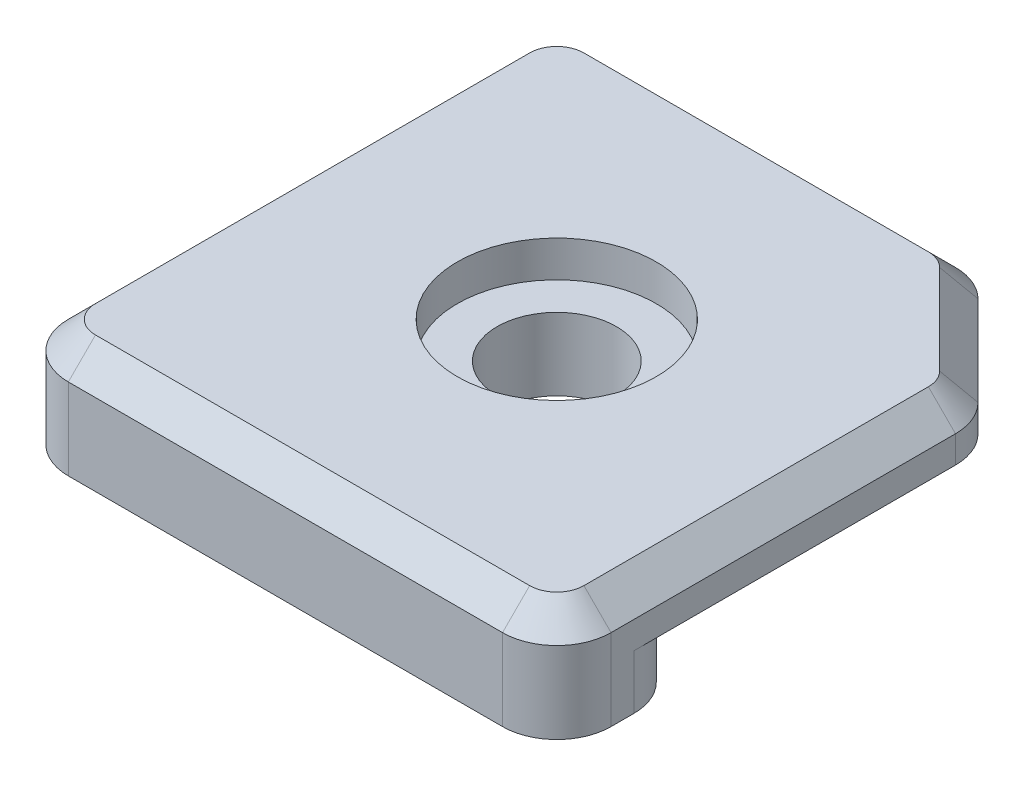
ISO-10303-21;
HEADER;
FILE_DESCRIPTION(('STEP AP214'),'2;1');
FILE_NAME('part.step','',(''),(''),'','','');
FILE_SCHEMA(('AUTOMOTIVE_DESIGN { 1 0 10303 214 1 1 1 1 }'));
ENDSEC;
DATA;
#1=APPLICATION_CONTEXT('core data for automotive mechanical design processes');
#2=APPLICATION_PROTOCOL_DEFINITION('international standard','automotive_design',2000,#1);
#3=PRODUCT_CONTEXT('',#1,'mechanical');
#4=PRODUCT('Part','Part','',(#3));
#5=PRODUCT_RELATED_PRODUCT_CATEGORY('part','',(#4));
#6=PRODUCT_DEFINITION_FORMATION('','',#4);
#7=PRODUCT_DEFINITION_CONTEXT('part definition',#1,'design');
#8=PRODUCT_DEFINITION('design','',#6,#7);
#9=PRODUCT_DEFINITION_SHAPE('','',#8);
#10=(LENGTH_UNIT() NAMED_UNIT(*) SI_UNIT(.MILLI.,.METRE.));
#11=(NAMED_UNIT(*) PLANE_ANGLE_UNIT() SI_UNIT($,.RADIAN.));
#12=(NAMED_UNIT(*) SI_UNIT($,.STERADIAN.) SOLID_ANGLE_UNIT());
#13=UNCERTAINTY_MEASURE_WITH_UNIT(LENGTH_MEASURE(1.E-05),#10,'distance_accuracy_value','');
#14=(GEOMETRIC_REPRESENTATION_CONTEXT(3) GLOBAL_UNCERTAINTY_ASSIGNED_CONTEXT((#13)) GLOBAL_UNIT_ASSIGNED_CONTEXT((#10,
#11,#12)) REPRESENTATION_CONTEXT('',''));
#15=CARTESIAN_POINT('',(0.,0.,0.));
#16=DIRECTION('',(0.,0.,1.));
#17=DIRECTION('',(1.,0.,0.));
#18=AXIS2_PLACEMENT_3D('',#15,#16,#17);
#19=CARTESIAN_POINT('',(15.,6.,-15.));
#20=DIRECTION('',(-1.,0.,0.));
#21=DIRECTION('',(0.,0.,1.));
#22=AXIS2_PLACEMENT_3D('',#19,#20,#21);
#23=PLANE('',#22);
#24=DIRECTION('',(0.,-1.,0.));
#25=VECTOR('',#24,1.);
#26=CARTESIAN_POINT('',(15.,6.,-7.03984489160852));
#27=LINE('',#26,#25);
#28=CARTESIAN_POINT('',(15.,3.,-7.03984489160852));
#29=VERTEX_POINT('',#28);
#30=CARTESIAN_POINT('',(15.,4.5,-7.03984489160852));
#31=VERTEX_POINT('',#30);
#32=EDGE_CURVE('E225',#29,#31,#27,.F.);
#33=ORIENTED_EDGE('',*,*,#32,.T.);
#34=DIRECTION('',(0.,0.,1.));
#35=VECTOR('',#34,1.);
#36=CARTESIAN_POINT('',(15.,4.5,12.));
#37=LINE('',#36,#35);
#38=CARTESIAN_POINT('',(15.,4.5,12.));
#39=VERTEX_POINT('',#38);
#40=EDGE_CURVE('E291',#31,#39,#37,.T.);
#41=ORIENTED_EDGE('',*,*,#40,.T.);
#42=DIRECTION('',(0.,-1.,0.));
#43=VECTOR('',#42,1.);
#44=CARTESIAN_POINT('',(15.,6.,12.));
#45=LINE('',#44,#43);
#46=CARTESIAN_POINT('',(15.,0.,12.));
#47=VERTEX_POINT('',#46);
#48=EDGE_CURVE('E180',#39,#47,#45,.T.);
#49=ORIENTED_EDGE('',*,*,#48,.T.);
#50=DIRECTION('',(0.,0.,-1.));
#51=VECTOR('',#50,1.);
#52=CARTESIAN_POINT('',(15.,0.,-15.));
#53=LINE('',#52,#51);
#54=CARTESIAN_POINT('',(15.,0.,10.7426406871193));
#55=VERTEX_POINT('',#54);
#56=EDGE_CURVE('E206',#47,#55,#53,.T.);
#57=ORIENTED_EDGE('',*,*,#56,.T.);
#58=DIRECTION('',(0.,-1.,0.));
#59=VECTOR('',#58,1.);
#60=CARTESIAN_POINT('',(15.,6.,10.7426406871193));
#61=LINE('',#60,#59);
#62=CARTESIAN_POINT('',(15.,3.,10.7426406871193));
#63=VERTEX_POINT('',#62);
#64=EDGE_CURVE('E175',#55,#63,#61,.F.);
#65=ORIENTED_EDGE('',*,*,#64,.T.);
#66=DIRECTION('',(0.,0.,1.));
#67=VECTOR('',#66,1.);
#68=CARTESIAN_POINT('',(15.,3.,-15.));
#69=LINE('',#68,#67);
#70=EDGE_CURVE('E196',#29,#63,#69,.T.);
#71=ORIENTED_EDGE('',*,*,#70,.F.);
#72=EDGE_LOOP('',(#33,#41,#49,#57,#65,#71));
#73=FACE_BOUND('',#72,.T.);
#74=ADVANCED_FACE('F35',(#73),#23,.F.);
#75=CARTESIAN_POINT('',(-15.,6.,-15.));
#76=DIRECTION('',(0.,0.,1.));
#77=DIRECTION('',(1.,0.,0.));
#78=AXIS2_PLACEMENT_3D('',#75,#76,#77);
#79=PLANE('',#78);
#80=DIRECTION('',(0.,-1.,0.));
#81=VECTOR('',#80,1.);
#82=CARTESIAN_POINT('',(-12.,6.,-15.));
#83=LINE('',#82,#81);
#84=CARTESIAN_POINT('',(-12.,0.,-15.));
#85=VERTEX_POINT('',#84);
#86=CARTESIAN_POINT('',(-12.,4.5,-15.));
#87=VERTEX_POINT('',#86);
#88=EDGE_CURVE('E231',#85,#87,#83,.F.);
#89=ORIENTED_EDGE('',*,*,#88,.T.);
#90=DIRECTION('',(1.,0.,0.));
#91=VECTOR('',#90,1.);
#92=CARTESIAN_POINT('',(7.03984489160851,4.5,-15.));
#93=LINE('',#92,#91);
#94=CARTESIAN_POINT('',(7.03984489160851,4.5,-15.));
#95=VERTEX_POINT('',#94);
#96=EDGE_CURVE('E283',#87,#95,#93,.T.);
#97=ORIENTED_EDGE('',*,*,#96,.T.);
#98=DIRECTION('',(0.,-1.,0.));
#99=VECTOR('',#98,1.);
#100=CARTESIAN_POINT('',(7.03984489160851,6.,-15.));
#101=LINE('',#100,#99);
#102=CARTESIAN_POINT('',(7.03984489160851,3.,-15.));
#103=VERTEX_POINT('',#102);
#104=EDGE_CURVE('E229',#95,#103,#101,.T.);
#105=ORIENTED_EDGE('',*,*,#104,.T.);
#106=DIRECTION('',(1.,0.,0.));
#107=VECTOR('',#106,1.);
#108=CARTESIAN_POINT('',(-9.5,3.,-15.));
#109=LINE('',#108,#107);
#110=CARTESIAN_POINT('',(-10.7426406871193,3.,-15.));
#111=VERTEX_POINT('',#110);
#112=EDGE_CURVE('E204',#111,#103,#109,.T.);
#113=ORIENTED_EDGE('',*,*,#112,.F.);
#114=DIRECTION('',(0.,-1.,0.));
#115=VECTOR('',#114,1.);
#116=CARTESIAN_POINT('',(-10.7426406871193,6.,-15.));
#117=LINE('',#116,#115);
#118=CARTESIAN_POINT('',(-10.7426406871193,0.,-15.));
#119=VERTEX_POINT('',#118);
#120=EDGE_CURVE('E234',#111,#119,#117,.T.);
#121=ORIENTED_EDGE('',*,*,#120,.T.);
#122=DIRECTION('',(-1.,0.,0.));
#123=VECTOR('',#122,1.);
#124=CARTESIAN_POINT('',(-15.,0.,-15.));
#125=LINE('',#124,#123);
#126=EDGE_CURVE('E208',#119,#85,#125,.T.);
#127=ORIENTED_EDGE('',*,*,#126,.T.);
#128=EDGE_LOOP('',(#89,#97,#105,#113,#121,#127));
#129=FACE_BOUND('',#128,.T.);
#130=ADVANCED_FACE('F402',(#129),#79,.F.);
#131=CARTESIAN_POINT('',(-15.,6.,-15.));
#132=DIRECTION('',(1.,0.,0.));
#133=DIRECTION('',(0.,0.,-1.));
#134=AXIS2_PLACEMENT_3D('',#131,#132,#133);
#135=PLANE('',#134);
#136=DIRECTION('',(0.,-1.,0.));
#137=VECTOR('',#136,1.);
#138=CARTESIAN_POINT('',(-15.,6.,12.));
#139=LINE('',#138,#137);
#140=CARTESIAN_POINT('',(-15.,0.,12.));
#141=VERTEX_POINT('',#140);
#142=CARTESIAN_POINT('',(-15.,4.5,12.));
#143=VERTEX_POINT('',#142);
#144=EDGE_CURVE('E243',#141,#143,#139,.F.);
#145=ORIENTED_EDGE('',*,*,#144,.T.);
#146=DIRECTION('',(0.,0.,-1.));
#147=VECTOR('',#146,1.);
#148=CARTESIAN_POINT('',(-15.,4.5,-12.));
#149=LINE('',#148,#147);
#150=CARTESIAN_POINT('',(-15.,4.5,-12.));
#151=VERTEX_POINT('',#150);
#152=EDGE_CURVE('E11',#143,#151,#149,.T.);
#153=ORIENTED_EDGE('',*,*,#152,.T.);
#154=DIRECTION('',(0.,-1.,0.));
#155=VECTOR('',#154,1.);
#156=CARTESIAN_POINT('',(-15.,6.,-12.));
#157=LINE('',#156,#155);
#158=CARTESIAN_POINT('',(-15.,0.,-12.));
#159=VERTEX_POINT('',#158);
#160=EDGE_CURVE('E241',#151,#159,#157,.T.);
#161=ORIENTED_EDGE('',*,*,#160,.T.);
#162=DIRECTION('',(0.,0.,1.));
#163=VECTOR('',#162,1.);
#164=CARTESIAN_POINT('',(-15.,0.,-15.));
#165=LINE('',#164,#163);
#166=EDGE_CURVE('E211',#159,#141,#165,.T.);
#167=ORIENTED_EDGE('',*,*,#166,.T.);
#168=EDGE_LOOP('',(#145,#153,#161,#167));
#169=FACE_BOUND('',#168,.T.);
#170=ADVANCED_FACE('F387',(#169),#135,.F.);
#171=CARTESIAN_POINT('',(-15.,6.,15.));
#172=DIRECTION('',(0.,0.,-1.));
#173=DIRECTION('',(-1.,0.,0.));
#174=AXIS2_PLACEMENT_3D('',#171,#172,#173);
#175=PLANE('',#174);
#176=DIRECTION('',(0.,-1.,0.));
#177=VECTOR('',#176,1.);
#178=CARTESIAN_POINT('',(12.,6.,15.));
#179=LINE('',#178,#177);
#180=CARTESIAN_POINT('',(12.,0.,15.));
#181=VERTEX_POINT('',#180);
#182=CARTESIAN_POINT('',(12.,4.5,15.));
#183=VERTEX_POINT('',#182);
#184=EDGE_CURVE('E237',#181,#183,#179,.F.);
#185=ORIENTED_EDGE('',*,*,#184,.T.);
#186=DIRECTION('',(-1.,0.,0.));
#187=VECTOR('',#186,1.);
#188=CARTESIAN_POINT('',(-12.,4.5,15.));
#189=LINE('',#188,#187);
#190=CARTESIAN_POINT('',(-12.,4.5,15.));
#191=VERTEX_POINT('',#190);
#192=EDGE_CURVE('E60',#183,#191,#189,.T.);
#193=ORIENTED_EDGE('',*,*,#192,.T.);
#194=DIRECTION('',(0.,-1.,0.));
#195=VECTOR('',#194,1.);
#196=CARTESIAN_POINT('',(-12.,6.,15.));
#197=LINE('',#196,#195);
#198=CARTESIAN_POINT('',(-12.,0.,15.));
#199=VERTEX_POINT('',#198);
#200=EDGE_CURVE('E239',#191,#199,#197,.T.);
#201=ORIENTED_EDGE('',*,*,#200,.T.);
#202=DIRECTION('',(1.,0.,0.));
#203=VECTOR('',#202,1.);
#204=CARTESIAN_POINT('',(-15.,0.,15.));
#205=LINE('',#204,#203);
#206=EDGE_CURVE('E214',#199,#181,#205,.T.);
#207=ORIENTED_EDGE('',*,*,#206,.T.);
#208=EDGE_LOOP('',(#185,#193,#201,#207));
#209=FACE_BOUND('',#208,.T.);
#210=ADVANCED_FACE('F423',(#209),#175,.F.);
#211=CARTESIAN_POINT('',(0.,6.,0.));
#212=DIRECTION('',(0.,1.,0.));
#213=DIRECTION('',(0.,0.,1.));
#214=AXIS2_PLACEMENT_3D('',#211,#212,#213);
#215=PLANE('',#214);
#216=CARTESIAN_POINT('',(0.,6.,0.));
#217=DIRECTION('',(0.,1.,0.));
#218=DIRECTION('',(0.,0.,1.));
#219=AXIS2_PLACEMENT_3D('',#216,#217,#218);
#220=CIRCLE('',#219,5.5);
#221=CARTESIAN_POINT('',(0.,6.,5.5));
#222=VERTEX_POINT('',#221);
#223=EDGE_CURVE('E416',#222,#222,#220,.T.);
#224=ORIENTED_EDGE('',*,*,#223,.F.);
#225=EDGE_LOOP('',(#224));
#226=FACE_BOUND('',#225,.T.);
#227=DIRECTION('',(-1.,0.,0.));
#228=VECTOR('',#227,1.);
#229=CARTESIAN_POINT('',(-12.,6.,-13.5));
#230=LINE('',#229,#228);
#231=CARTESIAN_POINT('',(7.03984489160851,6.,-13.5));
#232=VERTEX_POINT('',#231);
#233=CARTESIAN_POINT('',(-12.,6.,-13.5));
#234=VERTEX_POINT('',#233);
#235=EDGE_CURVE('E275',#232,#234,#230,.T.);
#236=ORIENTED_EDGE('',*,*,#235,.T.);
#237=CARTESIAN_POINT('',(-12.,6.,-12.));
#238=DIRECTION('',(0.,1.,0.));
#239=DIRECTION('',(0.,0.,1.));
#240=AXIS2_PLACEMENT_3D('',#237,#238,#239);
#241=CIRCLE('',#240,1.50000000000001);
#242=CARTESIAN_POINT('',(-13.5,6.,-12.));
#243=VERTEX_POINT('',#242);
#244=EDGE_CURVE('E277',#234,#243,#241,.T.);
#245=ORIENTED_EDGE('',*,*,#244,.T.);
#246=DIRECTION('',(0.,0.,1.));
#247=VECTOR('',#246,1.);
#248=CARTESIAN_POINT('',(-13.5,6.,12.));
#249=LINE('',#248,#247);
#250=CARTESIAN_POINT('',(-13.5,6.,12.));
#251=VERTEX_POINT('',#250);
#252=EDGE_CURVE('E259',#243,#251,#249,.T.);
#253=ORIENTED_EDGE('',*,*,#252,.T.);
#254=CARTESIAN_POINT('',(-12.,6.,12.));
#255=DIRECTION('',(0.,1.,0.));
#256=DIRECTION('',(0.,0.,1.));
#257=AXIS2_PLACEMENT_3D('',#254,#255,#256);
#258=CIRCLE('',#257,1.50000000000001);
#259=CARTESIAN_POINT('',(-12.,6.,13.5));
#260=VERTEX_POINT('',#259);
#261=EDGE_CURVE('E261',#251,#260,#258,.T.);
#262=ORIENTED_EDGE('',*,*,#261,.T.);
#263=DIRECTION('',(1.,0.,0.));
#264=VECTOR('',#263,1.);
#265=CARTESIAN_POINT('',(12.,6.,13.5));
#266=LINE('',#265,#264);
#267=CARTESIAN_POINT('',(12.,6.,13.5));
#268=VERTEX_POINT('',#267);
#269=EDGE_CURVE('E263',#260,#268,#266,.T.);
#270=ORIENTED_EDGE('',*,*,#269,.T.);
#271=CARTESIAN_POINT('',(12.,6.,12.));
#272=DIRECTION('',(0.,1.,0.));
#273=DIRECTION('',(0.,0.,1.));
#274=AXIS2_PLACEMENT_3D('',#271,#272,#273);
#275=CIRCLE('',#274,1.50000000000001);
#276=CARTESIAN_POINT('',(13.5,6.,12.));
#277=VERTEX_POINT('',#276);
#278=EDGE_CURVE('E265',#268,#277,#275,.T.);
#279=ORIENTED_EDGE('',*,*,#278,.T.);
#280=DIRECTION('',(0.,0.,-1.));
#281=VECTOR('',#280,1.);
#282=CARTESIAN_POINT('',(13.5,6.,-7.03984489160852));
#283=LINE('',#282,#281);
#284=CARTESIAN_POINT('',(13.5,6.,-7.03984489160852));
#285=VERTEX_POINT('',#284);
#286=EDGE_CURVE('E267',#277,#285,#283,.T.);
#287=ORIENTED_EDGE('',*,*,#286,.T.);
#288=CARTESIAN_POINT('',(12.,6.,-7.03984489160852));
#289=DIRECTION('',(0.,1.,0.));
#290=DIRECTION('',(0.,0.,1.));
#291=AXIS2_PLACEMENT_3D('',#288,#289,#290);
#292=CIRCLE('',#291,1.50000000000001);
#293=CARTESIAN_POINT('',(13.0606601717798,6.,-8.10050506338834));
#294=VERTEX_POINT('',#293);
#295=EDGE_CURVE('E269',#285,#294,#292,.T.);
#296=ORIENTED_EDGE('',*,*,#295,.T.);
#297=DIRECTION('',(-0.707106781186547,0.,-0.707106781186548));
#298=VECTOR('',#297,1.);
#299=CARTESIAN_POINT('',(8.10050506338834,6.,-13.0606601717798));
#300=LINE('',#299,#298);
#301=CARTESIAN_POINT('',(8.10050506338834,6.,-13.0606601717798));
#302=VERTEX_POINT('',#301);
#303=EDGE_CURVE('E271',#294,#302,#300,.T.);
#304=ORIENTED_EDGE('',*,*,#303,.T.);
#305=CARTESIAN_POINT('',(7.03984489160851,6.,-12.));
#306=DIRECTION('',(0.,1.,0.));
#307=DIRECTION('',(0.,0.,1.));
#308=AXIS2_PLACEMENT_3D('',#305,#306,#307);
#309=CIRCLE('',#308,1.50000000000001);
#310=EDGE_CURVE('E273',#302,#232,#309,.T.);
#311=ORIENTED_EDGE('',*,*,#310,.T.);
#312=EDGE_LOOP('',(#236,#245,#253,#262,#270,#279,#287,#296,#304,#311));
#313=FACE_BOUND('',#312,.T.);
#314=ADVANCED_FACE('F368',(#226,#313),#215,.T.);
#315=CARTESIAN_POINT('',(0.,0.,0.));
#316=DIRECTION('',(0.,1.,0.));
#317=DIRECTION('',(0.,0.,1.));
#318=AXIS2_PLACEMENT_3D('',#315,#316,#317);
#319=PLANE('',#318);
#320=CARTESIAN_POINT('',(0.,0.,0.));
#321=DIRECTION('',(0.,1.,0.));
#322=DIRECTION('',(0.,0.,1.));
#323=AXIS2_PLACEMENT_3D('',#320,#321,#322);
#324=CIRCLE('',#323,3.3);
#325=CARTESIAN_POINT('',(0.,0.,3.3));
#326=VERTEX_POINT('',#325);
#327=EDGE_CURVE('E300',#326,#326,#324,.T.);
#328=ORIENTED_EDGE('',*,*,#327,.T.);
#329=EDGE_LOOP('',(#328));
#330=FACE_BOUND('',#329,.T.);
#331=DIRECTION('',(-0.707106781186548,0.,-0.707106781186547));
#332=VECTOR('',#331,1.);
#333=CARTESIAN_POINT('',(15.,0.,9.5));
#334=LINE('',#333,#332);
#335=CARTESIAN_POINT('',(14.1213203435596,0.,8.62132034355964));
#336=VERTEX_POINT('',#335);
#337=CARTESIAN_POINT('',(-8.62132034355965,0.,-14.1213203435596));
#338=VERTEX_POINT('',#337);
#339=EDGE_CURVE('E187',#336,#338,#334,.T.);
#340=ORIENTED_EDGE('',*,*,#339,.F.);
#341=CARTESIAN_POINT('',(12.,0.,10.7426406871193));
#342=DIRECTION('',(0.,1.,0.));
#343=DIRECTION('',(0.,0.,1.));
#344=AXIS2_PLACEMENT_3D('',#341,#342,#343);
#345=CIRCLE('',#344,3.);
#346=EDGE_CURVE('E169',#336,#55,#345,.F.);
#347=ORIENTED_EDGE('',*,*,#346,.T.);
#348=ORIENTED_EDGE('',*,*,#56,.F.);
#349=CARTESIAN_POINT('',(12.,0.,12.));
#350=DIRECTION('',(0.,1.,0.));
#351=DIRECTION('',(0.,0.,1.));
#352=AXIS2_PLACEMENT_3D('',#349,#350,#351);
#353=CIRCLE('',#352,3.);
#354=EDGE_CURVE('E191',#47,#181,#353,.F.);
#355=ORIENTED_EDGE('',*,*,#354,.T.);
#356=ORIENTED_EDGE('',*,*,#206,.F.);
#357=CARTESIAN_POINT('',(-12.,0.,12.));
#358=DIRECTION('',(0.,1.,0.));
#359=DIRECTION('',(0.,0.,1.));
#360=AXIS2_PLACEMENT_3D('',#357,#358,#359);
#361=CIRCLE('',#360,3.);
#362=EDGE_CURVE('E221',#199,#141,#361,.F.);
#363=ORIENTED_EDGE('',*,*,#362,.T.);
#364=ORIENTED_EDGE('',*,*,#166,.F.);
#365=CARTESIAN_POINT('',(-12.,0.,-12.));
#366=DIRECTION('',(0.,1.,0.));
#367=DIRECTION('',(0.,0.,1.));
#368=AXIS2_PLACEMENT_3D('',#365,#366,#367);
#369=CIRCLE('',#368,3.);
#370=EDGE_CURVE('E219',#159,#85,#369,.F.);
#371=ORIENTED_EDGE('',*,*,#370,.T.);
#372=ORIENTED_EDGE('',*,*,#126,.F.);
#373=CARTESIAN_POINT('',(-10.7426406871193,0.,-12.));
#374=DIRECTION('',(0.,1.,0.));
#375=DIRECTION('',(0.,0.,1.));
#376=AXIS2_PLACEMENT_3D('',#373,#374,#375);
#377=CIRCLE('',#376,3.);
#378=EDGE_CURVE('E181',#119,#338,#377,.F.);
#379=ORIENTED_EDGE('',*,*,#378,.T.);
#380=EDGE_LOOP('',(#340,#347,#348,#355,#356,#363,#364,#371,#372,#379));
#381=FACE_BOUND('',#380,.T.);
#382=ADVANCED_FACE('F194',(#330,#381),#319,.F.);
#383=CARTESIAN_POINT('',(15.,3.,9.5));
#384=DIRECTION('',(-0.707106781186547,0.,0.707106781186548));
#385=DIRECTION('',(0.707106781186548,0.,0.707106781186547));
#386=AXIS2_PLACEMENT_3D('',#383,#384,#385);
#387=PLANE('',#386);
#388=DIRECTION('',(-0.707106781186548,0.,-0.707106781186547));
#389=VECTOR('',#388,1.);
#390=CARTESIAN_POINT('',(15.,3.,9.5));
#391=LINE('',#390,#389);
#392=CARTESIAN_POINT('',(14.1213203435596,3.,8.62132034355964));
#393=VERTEX_POINT('',#392);
#394=CARTESIAN_POINT('',(-8.62132034355965,3.,-14.1213203435596));
#395=VERTEX_POINT('',#394);
#396=EDGE_CURVE('E190',#393,#395,#391,.T.);
#397=ORIENTED_EDGE('',*,*,#396,.F.);
#398=DIRECTION('',(0.,-1.,0.));
#399=VECTOR('',#398,1.);
#400=CARTESIAN_POINT('',(14.1213203435596,3.,8.62132034355964));
#401=LINE('',#400,#399);
#402=EDGE_CURVE('E173',#393,#336,#401,.T.);
#403=ORIENTED_EDGE('',*,*,#402,.T.);
#404=ORIENTED_EDGE('',*,*,#339,.T.);
#405=DIRECTION('',(0.,-1.,0.));
#406=VECTOR('',#405,1.);
#407=CARTESIAN_POINT('',(-8.62132034355965,3.,-14.1213203435596));
#408=LINE('',#407,#406);
#409=EDGE_CURVE('E192',#338,#395,#408,.F.);
#410=ORIENTED_EDGE('',*,*,#409,.T.);
#411=EDGE_LOOP('',(#397,#403,#404,#410));
#412=FACE_BOUND('',#411,.T.);
#413=ADVANCED_FACE('F186',(#412),#387,.F.);
#414=CARTESIAN_POINT('',(0.,3.,0.));
#415=DIRECTION('',(0.,1.,0.));
#416=DIRECTION('',(0.,0.,1.));
#417=AXIS2_PLACEMENT_3D('',#414,#415,#416);
#418=PLANE('',#417);
#419=ORIENTED_EDGE('',*,*,#112,.T.);
#420=CARTESIAN_POINT('',(7.03984489160851,3.,-12.));
#421=DIRECTION('',(0.,1.,0.));
#422=DIRECTION('',(0.,0.,1.));
#423=AXIS2_PLACEMENT_3D('',#420,#421,#422);
#424=CIRCLE('',#423,3.);
#425=CARTESIAN_POINT('',(9.16116523516816,3.,-14.1213203435596));
#426=VERTEX_POINT('',#425);
#427=EDGE_CURVE('E247',#103,#426,#424,.F.);
#428=ORIENTED_EDGE('',*,*,#427,.T.);
#429=DIRECTION('',(-0.707106781186547,0.,-0.707106781186548));
#430=VECTOR('',#429,1.);
#431=CARTESIAN_POINT('',(8.2824855787278,3.,-15.));
#432=LINE('',#431,#430);
#433=CARTESIAN_POINT('',(14.1213203435596,3.,-9.16116523516816));
#434=VERTEX_POINT('',#433);
#435=EDGE_CURVE('E197',#434,#426,#432,.T.);
#436=ORIENTED_EDGE('',*,*,#435,.F.);
#437=CARTESIAN_POINT('',(12.,3.,-7.03984489160852));
#438=DIRECTION('',(0.,1.,0.));
#439=DIRECTION('',(0.,0.,1.));
#440=AXIS2_PLACEMENT_3D('',#437,#438,#439);
#441=CIRCLE('',#440,3.);
#442=EDGE_CURVE('E245',#434,#29,#441,.F.);
#443=ORIENTED_EDGE('',*,*,#442,.T.);
#444=ORIENTED_EDGE('',*,*,#70,.T.);
#445=CARTESIAN_POINT('',(12.,3.,10.7426406871193));
#446=DIRECTION('',(0.,1.,0.));
#447=DIRECTION('',(0.,0.,1.));
#448=AXIS2_PLACEMENT_3D('',#445,#446,#447);
#449=CIRCLE('',#448,3.);
#450=EDGE_CURVE('E254',#63,#393,#449,.T.);
#451=ORIENTED_EDGE('',*,*,#450,.T.);
#452=ORIENTED_EDGE('',*,*,#396,.T.);
#453=CARTESIAN_POINT('',(-10.7426406871193,3.,-12.));
#454=DIRECTION('',(0.,1.,0.));
#455=DIRECTION('',(0.,0.,1.));
#456=AXIS2_PLACEMENT_3D('',#453,#454,#455);
#457=CIRCLE('',#456,3.);
#458=EDGE_CURVE('E256',#395,#111,#457,.T.);
#459=ORIENTED_EDGE('',*,*,#458,.T.);
#460=EDGE_LOOP('',(#419,#428,#436,#443,#444,#451,#452,#459));
#461=FACE_BOUND('',#460,.T.);
#462=ADVANCED_FACE('F346',(#461),#418,.F.);
#463=CARTESIAN_POINT('',(8.2824855787278,6.,-15.));
#464=DIRECTION('',(-0.707106781186548,0.,0.707106781186547));
#465=DIRECTION('',(0.707106781186547,0.,0.707106781186548));
#466=AXIS2_PLACEMENT_3D('',#463,#464,#465);
#467=PLANE('',#466);
#468=DIRECTION('',(0.,-1.,0.));
#469=VECTOR('',#468,1.);
#470=CARTESIAN_POINT('',(9.16116523516816,6.,-14.1213203435596));
#471=LINE('',#470,#469);
#472=CARTESIAN_POINT('',(9.16116523516816,4.5,-14.1213203435596));
#473=VERTEX_POINT('',#472);
#474=EDGE_CURVE('E251',#426,#473,#471,.F.);
#475=ORIENTED_EDGE('',*,*,#474,.T.);
#476=DIRECTION('',(0.707106781186547,0.,0.707106781186548));
#477=VECTOR('',#476,1.);
#478=CARTESIAN_POINT('',(14.1213203435596,4.5,-9.16116523516816));
#479=LINE('',#478,#477);
#480=CARTESIAN_POINT('',(14.1213203435596,4.5,-9.16116523516816));
#481=VERTEX_POINT('',#480);
#482=EDGE_CURVE('E287',#473,#481,#479,.T.);
#483=ORIENTED_EDGE('',*,*,#482,.T.);
#484=DIRECTION('',(0.,-1.,0.));
#485=VECTOR('',#484,1.);
#486=CARTESIAN_POINT('',(14.1213203435596,6.,-9.16116523516816));
#487=LINE('',#486,#485);
#488=EDGE_CURVE('E249',#481,#434,#487,.T.);
#489=ORIENTED_EDGE('',*,*,#488,.T.);
#490=ORIENTED_EDGE('',*,*,#435,.T.);
#491=EDGE_LOOP('',(#475,#483,#489,#490));
#492=FACE_BOUND('',#491,.T.);
#493=ADVANCED_FACE('F354',(#492),#467,.F.);
#494=CARTESIAN_POINT('',(12.,3.,10.7426406871193));
#495=DIRECTION('',(0.,-1.,0.));
#496=DIRECTION('',(0.,0.,-1.));
#497=AXIS2_PLACEMENT_3D('',#494,#495,#496);
#498=CYLINDRICAL_SURFACE('',#497,3.);
#499=ORIENTED_EDGE('',*,*,#450,.F.);
#500=ORIENTED_EDGE('',*,*,#64,.F.);
#501=ORIENTED_EDGE('',*,*,#346,.F.);
#502=ORIENTED_EDGE('',*,*,#402,.F.);
#503=EDGE_LOOP('',(#499,#500,#501,#502));
#504=FACE_BOUND('',#503,.T.);
#505=ADVANCED_FACE('F172',(#504),#498,.T.);
#506=CARTESIAN_POINT('',(-10.7426406871193,6.,-12.));
#507=DIRECTION('',(0.,-1.,0.));
#508=DIRECTION('',(0.,0.,-1.));
#509=AXIS2_PLACEMENT_3D('',#506,#507,#508);
#510=CYLINDRICAL_SURFACE('',#509,3.);
#511=ORIENTED_EDGE('',*,*,#458,.F.);
#512=ORIENTED_EDGE('',*,*,#409,.F.);
#513=ORIENTED_EDGE('',*,*,#378,.F.);
#514=ORIENTED_EDGE('',*,*,#120,.F.);
#515=EDGE_LOOP('',(#511,#512,#513,#514));
#516=FACE_BOUND('',#515,.T.);
#517=ADVANCED_FACE('F443',(#516),#510,.T.);
#518=CARTESIAN_POINT('',(-12.,6.,12.));
#519=DIRECTION('',(0.,-1.,0.));
#520=DIRECTION('',(0.,0.,-1.));
#521=AXIS2_PLACEMENT_3D('',#518,#519,#520);
#522=CYLINDRICAL_SURFACE('',#521,3.);
#523=ORIENTED_EDGE('',*,*,#200,.F.);
#524=CARTESIAN_POINT('',(-12.,4.5,12.));
#525=DIRECTION('',(0.,1.,0.));
#526=DIRECTION('',(0.,0.,1.));
#527=AXIS2_PLACEMENT_3D('',#524,#525,#526);
#528=CIRCLE('',#527,3.);
#529=EDGE_CURVE('E45',#191,#143,#528,.F.);
#530=ORIENTED_EDGE('',*,*,#529,.T.);
#531=ORIENTED_EDGE('',*,*,#144,.F.);
#532=ORIENTED_EDGE('',*,*,#362,.F.);
#533=EDGE_LOOP('',(#523,#530,#531,#532));
#534=FACE_BOUND('',#533,.T.);
#535=ADVANCED_FACE('F446',(#534),#522,.T.);
#536=CARTESIAN_POINT('',(-12.,6.,-12.));
#537=DIRECTION('',(0.,-1.,0.));
#538=DIRECTION('',(0.,0.,-1.));
#539=AXIS2_PLACEMENT_3D('',#536,#537,#538);
#540=CYLINDRICAL_SURFACE('',#539,3.);
#541=ORIENTED_EDGE('',*,*,#160,.F.);
#542=CARTESIAN_POINT('',(-12.,4.5,-12.));
#543=DIRECTION('',(0.,1.,0.));
#544=DIRECTION('',(0.,0.,1.));
#545=AXIS2_PLACEMENT_3D('',#542,#543,#544);
#546=CIRCLE('',#545,3.);
#547=EDGE_CURVE('E280',#151,#87,#546,.F.);
#548=ORIENTED_EDGE('',*,*,#547,.T.);
#549=ORIENTED_EDGE('',*,*,#88,.F.);
#550=ORIENTED_EDGE('',*,*,#370,.F.);
#551=EDGE_LOOP('',(#541,#548,#549,#550));
#552=FACE_BOUND('',#551,.T.);
#553=ADVANCED_FACE('F391',(#552),#540,.T.);
#554=CARTESIAN_POINT('',(7.03984489160851,6.,-12.));
#555=DIRECTION('',(0.,-1.,0.));
#556=DIRECTION('',(0.,0.,-1.));
#557=AXIS2_PLACEMENT_3D('',#554,#555,#556);
#558=CYLINDRICAL_SURFACE('',#557,3.);
#559=ORIENTED_EDGE('',*,*,#104,.F.);
#560=CARTESIAN_POINT('',(7.03984489160851,4.5,-12.));
#561=DIRECTION('',(0.,1.,0.));
#562=DIRECTION('',(0.,0.,1.));
#563=AXIS2_PLACEMENT_3D('',#560,#561,#562);
#564=CIRCLE('',#563,3.);
#565=EDGE_CURVE('E285',#95,#473,#564,.F.);
#566=ORIENTED_EDGE('',*,*,#565,.T.);
#567=ORIENTED_EDGE('',*,*,#474,.F.);
#568=ORIENTED_EDGE('',*,*,#427,.F.);
#569=EDGE_LOOP('',(#559,#566,#567,#568));
#570=FACE_BOUND('',#569,.T.);
#571=ADVANCED_FACE('F405',(#570),#558,.T.);
#572=CARTESIAN_POINT('',(12.,6.,-7.03984489160852));
#573=DIRECTION('',(0.,-1.,0.));
#574=DIRECTION('',(0.,0.,-1.));
#575=AXIS2_PLACEMENT_3D('',#572,#573,#574);
#576=CYLINDRICAL_SURFACE('',#575,3.);
#577=ORIENTED_EDGE('',*,*,#488,.F.);
#578=CARTESIAN_POINT('',(12.,4.5,-7.03984489160852));
#579=DIRECTION('',(0.,1.,0.));
#580=DIRECTION('',(0.,0.,1.));
#581=AXIS2_PLACEMENT_3D('',#578,#579,#580);
#582=CIRCLE('',#581,3.);
#583=EDGE_CURVE('E289',#481,#31,#582,.F.);
#584=ORIENTED_EDGE('',*,*,#583,.T.);
#585=ORIENTED_EDGE('',*,*,#32,.F.);
#586=ORIENTED_EDGE('',*,*,#442,.F.);
#587=EDGE_LOOP('',(#577,#584,#585,#586));
#588=FACE_BOUND('',#587,.T.);
#589=ADVANCED_FACE('F352',(#588),#576,.T.);
#590=CARTESIAN_POINT('',(12.,6.,12.));
#591=DIRECTION('',(0.,-1.,0.));
#592=DIRECTION('',(0.,0.,-1.));
#593=AXIS2_PLACEMENT_3D('',#590,#591,#592);
#594=CYLINDRICAL_SURFACE('',#593,3.);
#595=ORIENTED_EDGE('',*,*,#48,.F.);
#596=CARTESIAN_POINT('',(12.,4.5,12.));
#597=DIRECTION('',(0.,1.,0.));
#598=DIRECTION('',(0.,0.,1.));
#599=AXIS2_PLACEMENT_3D('',#596,#597,#598);
#600=CIRCLE('',#599,3.);
#601=EDGE_CURVE('E293',#39,#183,#600,.F.);
#602=ORIENTED_EDGE('',*,*,#601,.T.);
#603=ORIENTED_EDGE('',*,*,#184,.F.);
#604=ORIENTED_EDGE('',*,*,#354,.F.);
#605=EDGE_LOOP('',(#595,#602,#603,#604));
#606=FACE_BOUND('',#605,.T.);
#607=ADVANCED_FACE('F341',(#606),#594,.T.);
#608=CARTESIAN_POINT('',(13.5,6.,0.));
#609=DIRECTION('',(0.70710678118655,0.707106781186545,0.));
#610=DIRECTION('',(0.,0.,1.));
#611=AXIS2_PLACEMENT_3D('',#608,#609,#610);
#612=PLANE('',#611);
#613=DIRECTION('',(-0.707106781186545,0.70710678118655,0.));
#614=VECTOR('',#613,1.);
#615=CARTESIAN_POINT('',(15.,4.5,12.));
#616=LINE('',#615,#614);
#617=EDGE_CURVE('E319',#39,#277,#616,.T.);
#618=ORIENTED_EDGE('',*,*,#617,.F.);
#619=ORIENTED_EDGE('',*,*,#40,.F.);
#620=DIRECTION('',(0.707106781186545,-0.70710678118655,0.));
#621=VECTOR('',#620,1.);
#622=CARTESIAN_POINT('',(13.5,6.,-7.03984489160852));
#623=LINE('',#622,#621);
#624=EDGE_CURVE('E40',#285,#31,#623,.T.);
#625=ORIENTED_EDGE('',*,*,#624,.F.);
#626=ORIENTED_EDGE('',*,*,#286,.F.);
#627=EDGE_LOOP('',(#618,#619,#625,#626));
#628=FACE_BOUND('',#627,.T.);
#629=ADVANCED_FACE('F38',(#628),#612,.T.);
#630=CARTESIAN_POINT('',(12.,6.,-7.03984489160852));
#631=DIRECTION('',(0.,-1.,0.));
#632=DIRECTION('',(0.,0.,-1.));
#633=AXIS2_PLACEMENT_3D('',#630,#631,#632);
#634=CONICAL_SURFACE('',#633,1.50000000000001,0.785398163397446);
#635=ORIENTED_EDGE('',*,*,#624,.T.);
#636=ORIENTED_EDGE('',*,*,#583,.F.);
#637=DIRECTION('',(0.499999999999999,-0.707106781186549,-0.499999999999999));
#638=VECTOR('',#637,1.);
#639=CARTESIAN_POINT('',(13.0606601717798,6.,-8.10050506338834));
#640=LINE('',#639,#638);
#641=EDGE_CURVE('E317',#294,#481,#640,.T.);
#642=ORIENTED_EDGE('',*,*,#641,.F.);
#643=ORIENTED_EDGE('',*,*,#295,.F.);
#644=EDGE_LOOP('',(#635,#636,#642,#643));
#645=FACE_BOUND('',#644,.T.);
#646=ADVANCED_FACE('F330',(#645),#634,.T.);
#647=CARTESIAN_POINT('',(12.,6.,12.));
#648=DIRECTION('',(0.,-1.,0.));
#649=DIRECTION('',(0.,0.,-1.));
#650=AXIS2_PLACEMENT_3D('',#647,#648,#649);
#651=CONICAL_SURFACE('',#650,1.50000000000001,0.785398163397446);
#652=ORIENTED_EDGE('',*,*,#617,.T.);
#653=ORIENTED_EDGE('',*,*,#278,.F.);
#654=DIRECTION('',(0.,0.707106781186549,-0.707106781186546));
#655=VECTOR('',#654,1.);
#656=CARTESIAN_POINT('',(12.,4.5,15.));
#657=LINE('',#656,#655);
#658=EDGE_CURVE('E314',#183,#268,#657,.T.);
#659=ORIENTED_EDGE('',*,*,#658,.F.);
#660=ORIENTED_EDGE('',*,*,#601,.F.);
#661=EDGE_LOOP('',(#652,#653,#659,#660));
#662=FACE_BOUND('',#661,.T.);
#663=ADVANCED_FACE('F372',(#662),#651,.T.);
#664=CARTESIAN_POINT('',(10.5805826175841,6.,-10.5805826175841));
#665=DIRECTION('',(0.500000000000001,0.707106781186546,-0.500000000000001));
#666=DIRECTION('',(0.707106781186547,0.,0.707106781186548));
#667=AXIS2_PLACEMENT_3D('',#664,#665,#666);
#668=PLANE('',#667);
#669=ORIENTED_EDGE('',*,*,#641,.T.);
#670=ORIENTED_EDGE('',*,*,#482,.F.);
#671=DIRECTION('',(0.499999999999999,-0.707106781186549,-0.499999999999999));
#672=VECTOR('',#671,1.);
#673=CARTESIAN_POINT('',(8.10050506338834,6.,-13.0606601717798));
#674=LINE('',#673,#672);
#675=EDGE_CURVE('E311',#302,#473,#674,.T.);
#676=ORIENTED_EDGE('',*,*,#675,.F.);
#677=ORIENTED_EDGE('',*,*,#303,.F.);
#678=EDGE_LOOP('',(#669,#670,#676,#677));
#679=FACE_BOUND('',#678,.T.);
#680=ADVANCED_FACE('F359',(#679),#668,.T.);
#681=CARTESIAN_POINT('',(0.,6.,13.5));
#682=DIRECTION('',(0.,0.707106781186546,0.707106781186549));
#683=DIRECTION('',(-1.,0.,0.));
#684=AXIS2_PLACEMENT_3D('',#681,#682,#683);
#685=PLANE('',#684);
#686=ORIENTED_EDGE('',*,*,#658,.T.);
#687=ORIENTED_EDGE('',*,*,#269,.F.);
#688=DIRECTION('',(0.,0.707106781186549,-0.707106781186546));
#689=VECTOR('',#688,1.);
#690=CARTESIAN_POINT('',(-12.,4.5,15.));
#691=LINE('',#690,#689);
#692=EDGE_CURVE('E308',#191,#260,#691,.T.);
#693=ORIENTED_EDGE('',*,*,#692,.F.);
#694=ORIENTED_EDGE('',*,*,#192,.F.);
#695=EDGE_LOOP('',(#686,#687,#693,#694));
#696=FACE_BOUND('',#695,.T.);
#697=ADVANCED_FACE('F374',(#696),#685,.T.);
#698=CARTESIAN_POINT('',(7.03984489160851,6.,-12.));
#699=DIRECTION('',(0.,-1.,0.));
#700=DIRECTION('',(0.,0.,-1.));
#701=AXIS2_PLACEMENT_3D('',#698,#699,#700);
#702=CONICAL_SURFACE('',#701,1.50000000000001,0.785398163397446);
#703=ORIENTED_EDGE('',*,*,#675,.T.);
#704=ORIENTED_EDGE('',*,*,#565,.F.);
#705=DIRECTION('',(0.,-0.707106781186549,-0.707106781186546));
#706=VECTOR('',#705,1.);
#707=CARTESIAN_POINT('',(7.03984489160851,6.,-13.5));
#708=LINE('',#707,#706);
#709=EDGE_CURVE('E305',#232,#95,#708,.T.);
#710=ORIENTED_EDGE('',*,*,#709,.F.);
#711=ORIENTED_EDGE('',*,*,#310,.F.);
#712=EDGE_LOOP('',(#703,#704,#710,#711));
#713=FACE_BOUND('',#712,.T.);
#714=ADVANCED_FACE('F364',(#713),#702,.T.);
#715=CARTESIAN_POINT('',(-12.,6.,12.));
#716=DIRECTION('',(0.,-1.,0.));
#717=DIRECTION('',(0.,0.,-1.));
#718=AXIS2_PLACEMENT_3D('',#715,#716,#717);
#719=CONICAL_SURFACE('',#718,1.50000000000001,0.785398163397446);
#720=ORIENTED_EDGE('',*,*,#692,.T.);
#721=ORIENTED_EDGE('',*,*,#261,.F.);
#722=DIRECTION('',(0.707106781186546,0.707106781186549,0.));
#723=VECTOR('',#722,1.);
#724=CARTESIAN_POINT('',(-15.,4.5,12.));
#725=LINE('',#724,#723);
#726=EDGE_CURVE('E302',#143,#251,#725,.T.);
#727=ORIENTED_EDGE('',*,*,#726,.F.);
#728=ORIENTED_EDGE('',*,*,#529,.F.);
#729=EDGE_LOOP('',(#720,#721,#727,#728));
#730=FACE_BOUND('',#729,.T.);
#731=ADVANCED_FACE('F379',(#730),#719,.T.);
#732=CARTESIAN_POINT('',(0.,6.,-13.5));
#733=DIRECTION('',(0.,0.707106781186546,-0.707106781186549));
#734=DIRECTION('',(1.,0.,0.));
#735=AXIS2_PLACEMENT_3D('',#732,#733,#734);
#736=PLANE('',#735);
#737=ORIENTED_EDGE('',*,*,#709,.T.);
#738=ORIENTED_EDGE('',*,*,#96,.F.);
#739=DIRECTION('',(0.,-0.707106781186549,-0.707106781186546));
#740=VECTOR('',#739,1.);
#741=CARTESIAN_POINT('',(-12.,6.,-13.5));
#742=LINE('',#741,#740);
#743=EDGE_CURVE('E299',#234,#87,#742,.T.);
#744=ORIENTED_EDGE('',*,*,#743,.F.);
#745=ORIENTED_EDGE('',*,*,#235,.F.);
#746=EDGE_LOOP('',(#737,#738,#744,#745));
#747=FACE_BOUND('',#746,.T.);
#748=ADVANCED_FACE('F399',(#747),#736,.T.);
#749=CARTESIAN_POINT('',(-13.5,6.,0.));
#750=DIRECTION('',(-0.707106781186549,0.707106781186546,0.));
#751=DIRECTION('',(0.,0.,-1.));
#752=AXIS2_PLACEMENT_3D('',#749,#750,#751);
#753=PLANE('',#752);
#754=ORIENTED_EDGE('',*,*,#726,.T.);
#755=ORIENTED_EDGE('',*,*,#252,.F.);
#756=DIRECTION('',(0.707106781186546,0.707106781186549,0.));
#757=VECTOR('',#756,1.);
#758=CARTESIAN_POINT('',(-15.,4.5,-12.));
#759=LINE('',#758,#757);
#760=EDGE_CURVE('E297',#151,#243,#759,.T.);
#761=ORIENTED_EDGE('',*,*,#760,.F.);
#762=ORIENTED_EDGE('',*,*,#152,.F.);
#763=EDGE_LOOP('',(#754,#755,#761,#762));
#764=FACE_BOUND('',#763,.T.);
#765=ADVANCED_FACE('F384',(#764),#753,.T.);
#766=CARTESIAN_POINT('',(-12.,6.,-12.));
#767=DIRECTION('',(0.,-1.,0.));
#768=DIRECTION('',(0.,0.,-1.));
#769=AXIS2_PLACEMENT_3D('',#766,#767,#768);
#770=CONICAL_SURFACE('',#769,1.50000000000001,0.785398163397446);
#771=ORIENTED_EDGE('',*,*,#743,.T.);
#772=ORIENTED_EDGE('',*,*,#547,.F.);
#773=ORIENTED_EDGE('',*,*,#760,.T.);
#774=ORIENTED_EDGE('',*,*,#244,.F.);
#775=EDGE_LOOP('',(#771,#772,#773,#774));
#776=FACE_BOUND('',#775,.T.);
#777=ADVANCED_FACE('F395',(#776),#770,.T.);
#778=CARTESIAN_POINT('',(0.,6.,0.));
#779=DIRECTION('',(0.,1.,0.));
#780=DIRECTION('',(0.,0.,1.));
#781=AXIS2_PLACEMENT_3D('',#778,#779,#780);
#782=CYLINDRICAL_SURFACE('',#781,3.3);
#783=ORIENTED_EDGE('',*,*,#327,.F.);
#784=EDGE_LOOP('',(#783));
#785=FACE_BOUND('',#784,.T.);
#786=CARTESIAN_POINT('',(0.,4.,0.));
#787=DIRECTION('',(0.,1.,0.));
#788=DIRECTION('',(0.,0.,1.));
#789=AXIS2_PLACEMENT_3D('',#786,#787,#788);
#790=CIRCLE('',#789,3.3);
#791=CARTESIAN_POINT('',(0.,4.,3.3));
#792=VERTEX_POINT('',#791);
#793=EDGE_CURVE('E410',#792,#792,#790,.T.);
#794=ORIENTED_EDGE('',*,*,#793,.T.);
#795=EDGE_LOOP('',(#794));
#796=FACE_BOUND('',#795,.T.);
#797=ADVANCED_FACE('F464',(#785,#796),#782,.F.);
#798=CARTESIAN_POINT('',(3.3,4.,0.));
#799=DIRECTION('',(0.,-1.,0.));
#800=DIRECTION('',(0.,0.,-1.));
#801=AXIS2_PLACEMENT_3D('',#798,#799,#800);
#802=PLANE('',#801);
#803=ORIENTED_EDGE('',*,*,#793,.F.);
#804=EDGE_LOOP('',(#803));
#805=FACE_BOUND('',#804,.T.);
#806=CARTESIAN_POINT('',(0.,4.,0.));
#807=DIRECTION('',(0.,1.,0.));
#808=DIRECTION('',(0.,0.,1.));
#809=AXIS2_PLACEMENT_3D('',#806,#807,#808);
#810=CIRCLE('',#809,5.5);
#811=CARTESIAN_POINT('',(0.,4.,5.5));
#812=VERTEX_POINT('',#811);
#813=EDGE_CURVE('E413',#812,#812,#810,.T.);
#814=ORIENTED_EDGE('',*,*,#813,.T.);
#815=EDGE_LOOP('',(#814));
#816=FACE_BOUND('',#815,.T.);
#817=ADVANCED_FACE('F569',(#805,#816),#802,.F.);
#818=CARTESIAN_POINT('',(0.,6.,0.));
#819=DIRECTION('',(0.,1.,0.));
#820=DIRECTION('',(0.,0.,1.));
#821=AXIS2_PLACEMENT_3D('',#818,#819,#820);
#822=CYLINDRICAL_SURFACE('',#821,5.5);
#823=ORIENTED_EDGE('',*,*,#813,.F.);
#824=EDGE_LOOP('',(#823));
#825=FACE_BOUND('',#824,.T.);
#826=ORIENTED_EDGE('',*,*,#223,.T.);
#827=EDGE_LOOP('',(#826));
#828=FACE_BOUND('',#827,.T.);
#829=ADVANCED_FACE('F420',(#825,#828),#822,.F.);
#830=CLOSED_SHELL('',(#74,#130,#170,#210,#314,#382,#413,#462,#493,#505,#517,#535,#553,#571,#589,
#607,#629,#646,#663,#680,#697,#714,#731,#748,#765,#777,#797,#817,#829));
#831=MANIFOLD_SOLID_BREP('B2',#830);
#832=ADVANCED_BREP_SHAPE_REPRESENTATION('',(#18,#831),#14);
#833=SHAPE_DEFINITION_REPRESENTATION(#9,#832);
ENDSEC;
END-ISO-10303-21;
